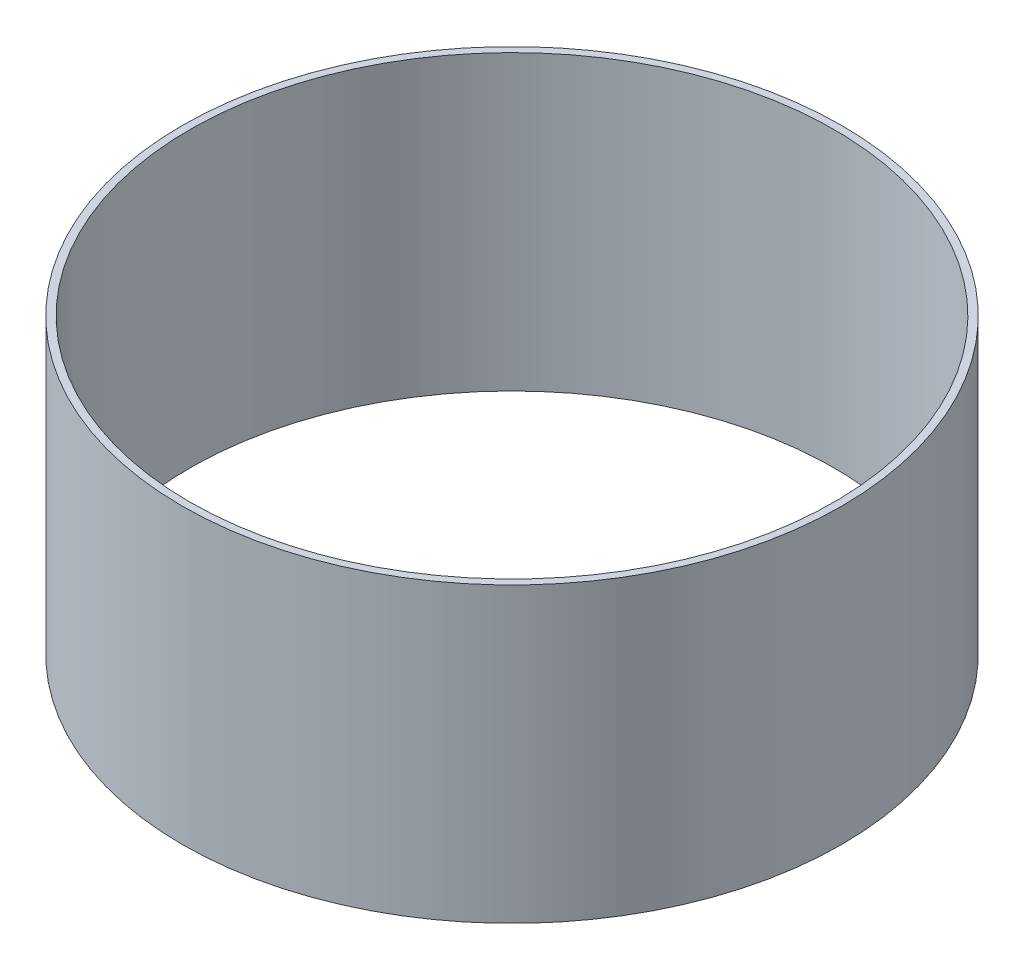
ISO-10303-21;
HEADER;
FILE_DESCRIPTION(('STEP AP214'),'2;1');
FILE_NAME('part.step','',(''),(''),'','','');
FILE_SCHEMA(('AUTOMOTIVE_DESIGN { 1 0 10303 214 1 1 1 1 }'));
ENDSEC;
DATA;
#1=APPLICATION_CONTEXT('core data for automotive mechanical design processes');
#2=APPLICATION_PROTOCOL_DEFINITION('international standard','automotive_design',2000,#1);
#3=PRODUCT_CONTEXT('',#1,'mechanical');
#4=PRODUCT('Part','Part','',(#3));
#5=PRODUCT_RELATED_PRODUCT_CATEGORY('part','',(#4));
#6=PRODUCT_DEFINITION_FORMATION('','',#4);
#7=PRODUCT_DEFINITION_CONTEXT('part definition',#1,'design');
#8=PRODUCT_DEFINITION('design','',#6,#7);
#9=PRODUCT_DEFINITION_SHAPE('','',#8);
#10=(LENGTH_UNIT() NAMED_UNIT(*) SI_UNIT(.MILLI.,.METRE.));
#11=(NAMED_UNIT(*) PLANE_ANGLE_UNIT() SI_UNIT($,.RADIAN.));
#12=(NAMED_UNIT(*) SI_UNIT($,.STERADIAN.) SOLID_ANGLE_UNIT());
#13=UNCERTAINTY_MEASURE_WITH_UNIT(LENGTH_MEASURE(1.E-05),#10,'distance_accuracy_value','');
#14=(GEOMETRIC_REPRESENTATION_CONTEXT(3) GLOBAL_UNCERTAINTY_ASSIGNED_CONTEXT((#13)) GLOBAL_UNIT_ASSIGNED_CONTEXT((#10,
#11,#12)) REPRESENTATION_CONTEXT('',''));
#15=CARTESIAN_POINT('',(0.,0.,0.));
#16=DIRECTION('',(0.,0.,1.));
#17=DIRECTION('',(1.,0.,0.));
#18=AXIS2_PLACEMENT_3D('',#15,#16,#17);
#19=CARTESIAN_POINT('',(0.,20.,0.));
#20=DIRECTION('',(0.,-1.,0.));
#21=DIRECTION('',(0.,0.,-1.));
#22=AXIS2_PLACEMENT_3D('',#19,#20,#21);
#23=CYLINDRICAL_SURFACE('',#22,22.5);
#24=CARTESIAN_POINT('',(0.,20.,0.));
#25=DIRECTION('',(0.,1.,0.));
#26=DIRECTION('',(0.,0.,1.));
#27=AXIS2_PLACEMENT_3D('',#24,#25,#26);
#28=CIRCLE('',#27,22.5);
#29=CARTESIAN_POINT('',(0.,20.,22.5));
#30=VERTEX_POINT('',#29);
#31=EDGE_CURVE('E10',#30,#30,#28,.T.);
#32=ORIENTED_EDGE('',*,*,#31,.F.);
#33=EDGE_LOOP('',(#32));
#34=FACE_BOUND('',#33,.T.);
#35=CARTESIAN_POINT('',(0.,0.,0.));
#36=DIRECTION('',(0.,1.,0.));
#37=DIRECTION('',(0.,0.,1.));
#38=AXIS2_PLACEMENT_3D('',#35,#36,#37);
#39=CIRCLE('',#38,22.5);
#40=CARTESIAN_POINT('',(0.,0.,22.5));
#41=VERTEX_POINT('',#40);
#42=EDGE_CURVE('E34',#41,#41,#39,.T.);
#43=ORIENTED_EDGE('',*,*,#42,.T.);
#44=EDGE_LOOP('',(#43));
#45=FACE_BOUND('',#44,.T.);
#46=ADVANCED_FACE('F31',(#34,#45),#23,.T.);
#47=CARTESIAN_POINT('',(0.,20.,0.));
#48=DIRECTION('',(0.,1.,0.));
#49=DIRECTION('',(0.,0.,1.));
#50=AXIS2_PLACEMENT_3D('',#47,#48,#49);
#51=PLANE('',#50);
#52=CARTESIAN_POINT('',(0.,20.,0.));
#53=DIRECTION('',(0.,1.,0.));
#54=DIRECTION('',(0.,0.,1.));
#55=AXIS2_PLACEMENT_3D('',#52,#53,#54);
#56=CIRCLE('',#55,22.);
#57=CARTESIAN_POINT('',(0.,20.,22.));
#58=VERTEX_POINT('',#57);
#59=EDGE_CURVE('E43',#58,#58,#56,.T.);
#60=ORIENTED_EDGE('',*,*,#59,.F.);
#61=EDGE_LOOP('',(#60));
#62=FACE_BOUND('',#61,.T.);
#63=ORIENTED_EDGE('',*,*,#31,.T.);
#64=EDGE_LOOP('',(#63));
#65=FACE_BOUND('',#64,.T.);
#66=ADVANCED_FACE('F58',(#62,#65),#51,.T.);
#67=CARTESIAN_POINT('',(0.,0.,0.));
#68=DIRECTION('',(0.,1.,0.));
#69=DIRECTION('',(0.,0.,1.));
#70=AXIS2_PLACEMENT_3D('',#67,#68,#69);
#71=PLANE('',#70);
#72=CARTESIAN_POINT('',(0.,0.,0.));
#73=DIRECTION('',(0.,1.,0.));
#74=DIRECTION('',(0.,0.,1.));
#75=AXIS2_PLACEMENT_3D('',#72,#73,#74);
#76=CIRCLE('',#75,22.);
#77=CARTESIAN_POINT('',(0.,0.,22.));
#78=VERTEX_POINT('',#77);
#79=EDGE_CURVE('E41',#78,#78,#76,.T.);
#80=ORIENTED_EDGE('',*,*,#79,.T.);
#81=EDGE_LOOP('',(#80));
#82=FACE_BOUND('',#81,.T.);
#83=ORIENTED_EDGE('',*,*,#42,.F.);
#84=EDGE_LOOP('',(#83));
#85=FACE_BOUND('',#84,.T.);
#86=ADVANCED_FACE('F49',(#82,#85),#71,.F.);
#87=CARTESIAN_POINT('',(0.,0.,0.));
#88=DIRECTION('',(0.,1.,0.));
#89=DIRECTION('',(0.,0.,1.));
#90=AXIS2_PLACEMENT_3D('',#87,#88,#89);
#91=CYLINDRICAL_SURFACE('',#90,22.);
#92=ORIENTED_EDGE('',*,*,#79,.F.);
#93=EDGE_LOOP('',(#92));
#94=FACE_BOUND('',#93,.T.);
#95=ORIENTED_EDGE('',*,*,#59,.T.);
#96=EDGE_LOOP('',(#95));
#97=FACE_BOUND('',#96,.T.);
#98=ADVANCED_FACE('F52',(#94,#97),#91,.F.);
#99=CLOSED_SHELL('',(#46,#66,#86,#98));
#100=MANIFOLD_SOLID_BREP('B2',#99);
#101=ADVANCED_BREP_SHAPE_REPRESENTATION('',(#18,#100),#14);
#102=SHAPE_DEFINITION_REPRESENTATION(#9,#101);
ENDSEC;
END-ISO-10303-21;
